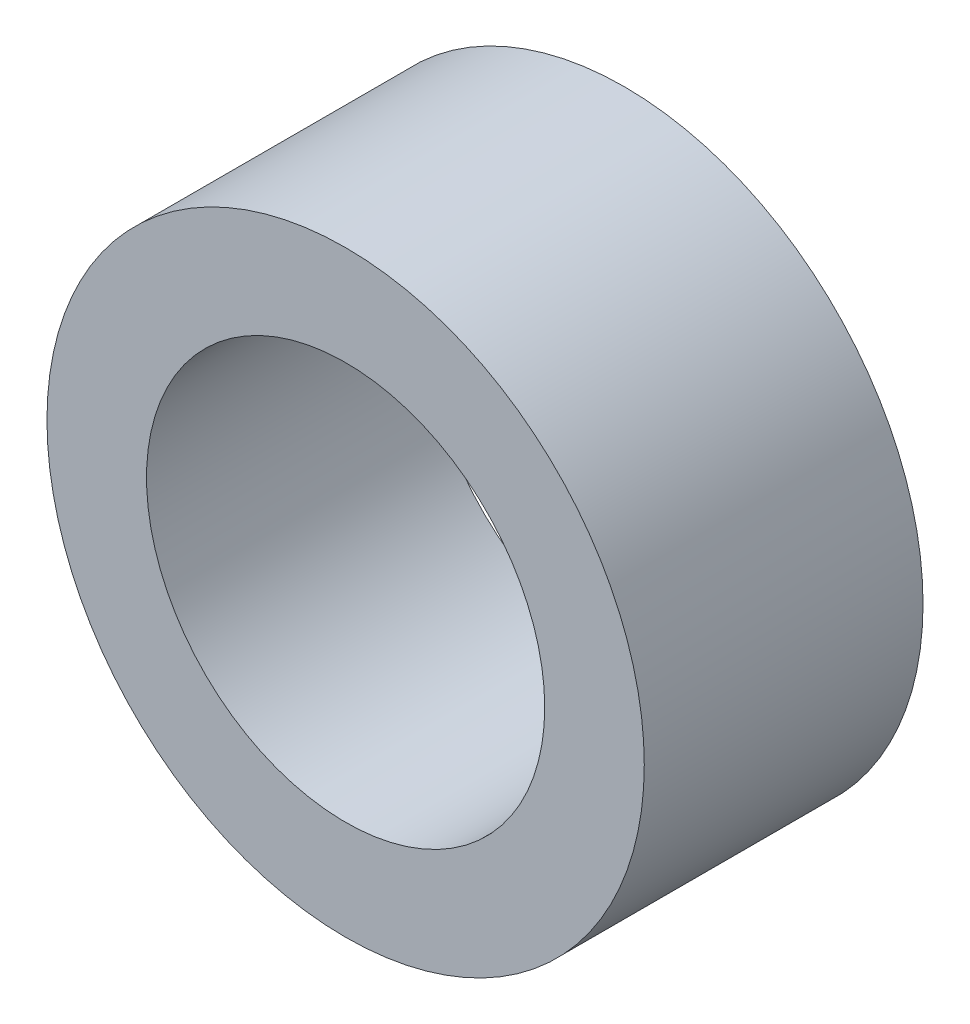
ISO-10303-21;
HEADER;
FILE_DESCRIPTION(('STEP AP214'),'2;1');
FILE_NAME('part.step','',(''),(''),'','','');
FILE_SCHEMA(('AUTOMOTIVE_DESIGN { 1 0 10303 214 1 1 1 1 }'));
ENDSEC;
DATA;
#1=APPLICATION_CONTEXT('core data for automotive mechanical design processes');
#2=APPLICATION_PROTOCOL_DEFINITION('international standard','automotive_design',2000,#1);
#3=PRODUCT_CONTEXT('',#1,'mechanical');
#4=PRODUCT('Part','Part','',(#3));
#5=PRODUCT_RELATED_PRODUCT_CATEGORY('part','',(#4));
#6=PRODUCT_DEFINITION_FORMATION('','',#4);
#7=PRODUCT_DEFINITION_CONTEXT('part definition',#1,'design');
#8=PRODUCT_DEFINITION('design','',#6,#7);
#9=PRODUCT_DEFINITION_SHAPE('','',#8);
#10=(LENGTH_UNIT() NAMED_UNIT(*) SI_UNIT(.MILLI.,.METRE.));
#11=(NAMED_UNIT(*) PLANE_ANGLE_UNIT() SI_UNIT($,.RADIAN.));
#12=(NAMED_UNIT(*) SI_UNIT($,.STERADIAN.) SOLID_ANGLE_UNIT());
#13=UNCERTAINTY_MEASURE_WITH_UNIT(LENGTH_MEASURE(1.E-05),#10,'distance_accuracy_value','');
#14=(GEOMETRIC_REPRESENTATION_CONTEXT(3) GLOBAL_UNCERTAINTY_ASSIGNED_CONTEXT((#13)) GLOBAL_UNIT_ASSIGNED_CONTEXT((#10,
#11,#12)) REPRESENTATION_CONTEXT('',''));
#15=CARTESIAN_POINT('',(0.,0.,0.));
#16=DIRECTION('',(0.,0.,1.));
#17=DIRECTION('',(1.,0.,0.));
#18=AXIS2_PLACEMENT_3D('',#15,#16,#17);
#19=CARTESIAN_POINT('',(0.,0.,14.));
#20=DIRECTION('',(0.,0.,1.));
#21=DIRECTION('',(1.,0.,0.));
#22=AXIS2_PLACEMENT_3D('',#19,#20,#21);
#23=PLANE('',#22);
#24=CARTESIAN_POINT('',(0.,0.,14.));
#25=DIRECTION('',(0.,0.,1.));
#26=DIRECTION('',(1.,0.,0.));
#27=AXIS2_PLACEMENT_3D('',#24,#25,#26);
#28=CIRCLE('',#27,30.);
#29=CARTESIAN_POINT('',(30.,0.,14.));
#30=VERTEX_POINT('',#29);
#31=EDGE_CURVE('E10',#30,#30,#28,.T.);
#32=ORIENTED_EDGE('',*,*,#31,.T.);
#33=EDGE_LOOP('',(#32));
#34=FACE_BOUND('',#33,.T.);
#35=CARTESIAN_POINT('',(0.,0.,14.));
#36=DIRECTION('',(0.,0.,1.));
#37=DIRECTION('',(1.,0.,0.));
#38=AXIS2_PLACEMENT_3D('',#35,#36,#37);
#39=CIRCLE('',#38,20.);
#40=CARTESIAN_POINT('',(20.,0.,14.));
#41=VERTEX_POINT('',#40);
#42=EDGE_CURVE('E44',#41,#41,#39,.T.);
#43=ORIENTED_EDGE('',*,*,#42,.F.);
#44=EDGE_LOOP('',(#43));
#45=FACE_BOUND('',#44,.T.);
#46=ADVANCED_FACE('F33',(#34,#45),#23,.T.);
#47=CARTESIAN_POINT('',(0.,0.,-14.));
#48=DIRECTION('',(0.,0.,1.));
#49=DIRECTION('',(1.,0.,0.));
#50=AXIS2_PLACEMENT_3D('',#47,#48,#49);
#51=PLANE('',#50);
#52=CARTESIAN_POINT('',(0.,0.,-14.));
#53=DIRECTION('',(0.,0.,1.));
#54=DIRECTION('',(1.,0.,0.));
#55=AXIS2_PLACEMENT_3D('',#52,#53,#54);
#56=CIRCLE('',#55,30.);
#57=CARTESIAN_POINT('',(30.,0.,-14.));
#58=VERTEX_POINT('',#57);
#59=EDGE_CURVE('E37',#58,#58,#56,.T.);
#60=ORIENTED_EDGE('',*,*,#59,.F.);
#61=EDGE_LOOP('',(#60));
#62=FACE_BOUND('',#61,.T.);
#63=CARTESIAN_POINT('',(0.,0.,-14.));
#64=DIRECTION('',(0.,0.,1.));
#65=DIRECTION('',(1.,0.,0.));
#66=AXIS2_PLACEMENT_3D('',#63,#64,#65);
#67=CIRCLE('',#66,20.);
#68=CARTESIAN_POINT('',(20.,0.,-14.));
#69=VERTEX_POINT('',#68);
#70=EDGE_CURVE('E46',#69,#69,#67,.T.);
#71=ORIENTED_EDGE('',*,*,#70,.T.);
#72=EDGE_LOOP('',(#71));
#73=FACE_BOUND('',#72,.T.);
#74=ADVANCED_FACE('F56',(#62,#73),#51,.F.);
#75=CARTESIAN_POINT('',(0.,0.,14.));
#76=DIRECTION('',(0.,0.,-1.));
#77=DIRECTION('',(-1.,0.,0.));
#78=AXIS2_PLACEMENT_3D('',#75,#76,#77);
#79=CYLINDRICAL_SURFACE('',#78,30.);
#80=ORIENTED_EDGE('',*,*,#31,.F.);
#81=EDGE_LOOP('',(#80));
#82=FACE_BOUND('',#81,.T.);
#83=ORIENTED_EDGE('',*,*,#59,.T.);
#84=EDGE_LOOP('',(#83));
#85=FACE_BOUND('',#84,.T.);
#86=ADVANCED_FACE('F35',(#82,#85),#79,.T.);
#87=CARTESIAN_POINT('',(0.,0.,14.));
#88=DIRECTION('',(0.,0.,-1.));
#89=DIRECTION('',(-1.,0.,0.));
#90=AXIS2_PLACEMENT_3D('',#87,#88,#89);
#91=CYLINDRICAL_SURFACE('',#90,20.);
#92=ORIENTED_EDGE('',*,*,#42,.T.);
#93=EDGE_LOOP('',(#92));
#94=FACE_BOUND('',#93,.T.);
#95=ORIENTED_EDGE('',*,*,#70,.F.);
#96=EDGE_LOOP('',(#95));
#97=FACE_BOUND('',#96,.T.);
#98=ADVANCED_FACE('F52',(#94,#97),#91,.F.);
#99=CLOSED_SHELL('',(#46,#74,#86,#98));
#100=MANIFOLD_SOLID_BREP('B2',#99);
#101=ADVANCED_BREP_SHAPE_REPRESENTATION('',(#18,#100),#14);
#102=SHAPE_DEFINITION_REPRESENTATION(#9,#101);
ENDSEC;
END-ISO-10303-21;
